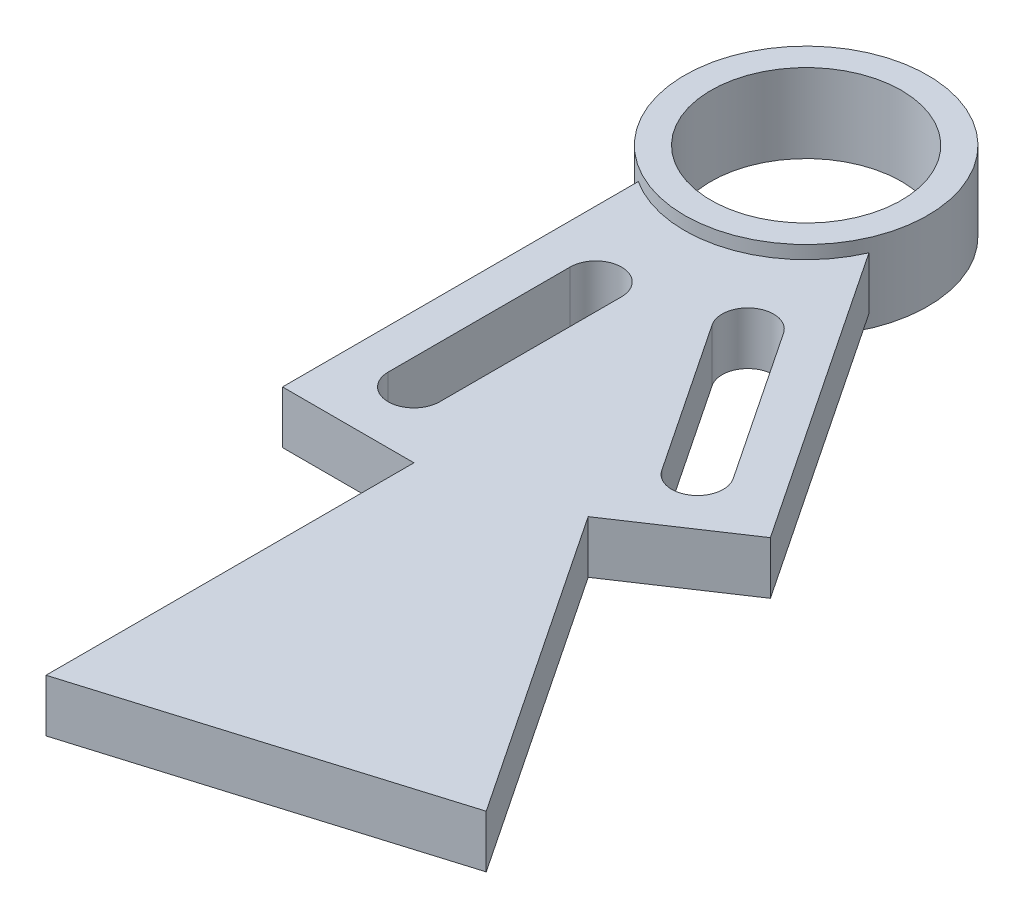
ISO-10303-21;
HEADER;
FILE_DESCRIPTION(('STEP AP214'),'2;1');
FILE_NAME('part.step','',(''),(''),'','','');
FILE_SCHEMA(('AUTOMOTIVE_DESIGN { 1 0 10303 214 1 1 1 1 }'));
ENDSEC;
DATA;
#1=APPLICATION_CONTEXT('core data for automotive mechanical design processes');
#2=APPLICATION_PROTOCOL_DEFINITION('international standard','automotive_design',2000,#1);
#3=PRODUCT_CONTEXT('',#1,'mechanical');
#4=PRODUCT('Part','Part','',(#3));
#5=PRODUCT_RELATED_PRODUCT_CATEGORY('part','',(#4));
#6=PRODUCT_DEFINITION_FORMATION('','',#4);
#7=PRODUCT_DEFINITION_CONTEXT('part definition',#1,'design');
#8=PRODUCT_DEFINITION('design','',#6,#7);
#9=PRODUCT_DEFINITION_SHAPE('','',#8);
#10=(LENGTH_UNIT() NAMED_UNIT(*) SI_UNIT(.MILLI.,.METRE.));
#11=(NAMED_UNIT(*) PLANE_ANGLE_UNIT() SI_UNIT($,.RADIAN.));
#12=(NAMED_UNIT(*) SI_UNIT($,.STERADIAN.) SOLID_ANGLE_UNIT());
#13=UNCERTAINTY_MEASURE_WITH_UNIT(LENGTH_MEASURE(1.E-05),#10,'distance_accuracy_value','');
#14=(GEOMETRIC_REPRESENTATION_CONTEXT(3) GLOBAL_UNCERTAINTY_ASSIGNED_CONTEXT((#13)) GLOBAL_UNIT_ASSIGNED_CONTEXT((#10,
#11,#12)) REPRESENTATION_CONTEXT('',''));
#15=CARTESIAN_POINT('',(0.,0.,0.));
#16=DIRECTION('',(0.,0.,1.));
#17=DIRECTION('',(1.,0.,0.));
#18=AXIS2_PLACEMENT_3D('',#15,#16,#17);
#19=CARTESIAN_POINT('',(0.,4.7625,0.));
#20=DIRECTION('',(0.,-1.,0.));
#21=DIRECTION('',(0.,0.,-1.));
#22=AXIS2_PLACEMENT_3D('',#19,#20,#21);
#23=CYLINDRICAL_SURFACE('',#22,11.5062);
#24=CARTESIAN_POINT('',(0.,4.7625,0.));
#25=DIRECTION('',(0.,1.,0.));
#26=DIRECTION('',(0.,0.,1.));
#27=AXIS2_PLACEMENT_3D('',#24,#25,#26);
#28=CIRCLE('',#27,11.5062);
#29=CARTESIAN_POINT('',(0.,4.7625,-11.5062));
#30=VERTEX_POINT('',#29);
#31=EDGE_CURVE('E53',#30,#30,#28,.T.);
#32=CARTESIAN_POINT('',(0.,-4.7625,0.));
#33=DIRECTION('',(0.,1.,0.));
#34=DIRECTION('',(0.,0.,1.));
#35=AXIS2_PLACEMENT_3D('',#32,#33,#34);
#36=CIRCLE('',#35,11.5062);
#37=CARTESIAN_POINT('',(0.,-4.7625,-11.5062));
#38=VERTEX_POINT('',#37);
#39=EDGE_CURVE('E273',#38,#38,#36,.T.);
#40=CARTESIAN_POINT('',(0.,4.7625,-11.5062));
#41=CARTESIAN_POINT('',(0.,4.66328125,-11.5062));
#42=CARTESIAN_POINT('',(0.,4.5640625,-11.5062));
#43=CARTESIAN_POINT('',(0.,4.365625,-11.5062));
#44=CARTESIAN_POINT('',(0.,4.26640625,-11.5062));
#45=CARTESIAN_POINT('',(0.,4.06796875,-11.5062));
#46=CARTESIAN_POINT('',(0.,3.96875,-11.5062));
#47=CARTESIAN_POINT('',(0.,3.7703125,-11.5062));
#48=CARTESIAN_POINT('',(0.,3.67109375,-11.5062));
#49=CARTESIAN_POINT('',(0.,3.47265625,-11.5062));
#50=CARTESIAN_POINT('',(0.,3.3734375,-11.5062));
#51=CARTESIAN_POINT('',(0.,3.175,-11.5062));
#52=CARTESIAN_POINT('',(0.,3.07578125,-11.5062));
#53=CARTESIAN_POINT('',(0.,2.87734375,-11.5062));
#54=CARTESIAN_POINT('',(0.,2.778125,-11.5062));
#55=CARTESIAN_POINT('',(0.,2.5796875,-11.5062));
#56=CARTESIAN_POINT('',(0.,2.48046875,-11.5062));
#57=CARTESIAN_POINT('',(0.,2.28203125,-11.5062));
#58=CARTESIAN_POINT('',(0.,2.1828125,-11.5062));
#59=CARTESIAN_POINT('',(0.,1.984375,-11.5062));
#60=CARTESIAN_POINT('',(0.,1.88515625,-11.5062));
#61=CARTESIAN_POINT('',(0.,1.68671875,-11.5062));
#62=CARTESIAN_POINT('',(0.,1.5875,-11.5062));
#63=CARTESIAN_POINT('',(0.,1.3890625,-11.5062));
#64=CARTESIAN_POINT('',(0.,1.28984375,-11.5062));
#65=CARTESIAN_POINT('',(0.,1.09140625,-11.5062));
#66=CARTESIAN_POINT('',(0.,0.992187499999999,-11.5062));
#67=CARTESIAN_POINT('',(0.,0.79375,-11.5062));
#68=CARTESIAN_POINT('',(0.,0.69453125,-11.5062));
#69=CARTESIAN_POINT('',(0.,0.49609375,-11.5062));
#70=CARTESIAN_POINT('',(0.,0.396875,-11.5062));
#71=CARTESIAN_POINT('',(0.,0.1984375,-11.5062));
#72=CARTESIAN_POINT('',(0.,0.0992187500000001,-11.5062));
#73=CARTESIAN_POINT('',(0.,-0.0992187500000001,-11.5062));
#74=CARTESIAN_POINT('',(0.,-0.1984375,-11.5062));
#75=CARTESIAN_POINT('',(0.,-0.396875,-11.5062));
#76=CARTESIAN_POINT('',(0.,-0.49609375,-11.5062));
#77=CARTESIAN_POINT('',(0.,-0.69453125,-11.5062));
#78=CARTESIAN_POINT('',(0.,-0.793750000000001,-11.5062));
#79=CARTESIAN_POINT('',(0.,-0.992187500000001,-11.5062));
#80=CARTESIAN_POINT('',(0.,-1.09140625,-11.5062));
#81=CARTESIAN_POINT('',(0.,-1.28984375,-11.5062));
#82=CARTESIAN_POINT('',(0.,-1.3890625,-11.5062));
#83=CARTESIAN_POINT('',(0.,-1.5875,-11.5062));
#84=CARTESIAN_POINT('',(0.,-1.68671875,-11.5062));
#85=CARTESIAN_POINT('',(0.,-1.88515625,-11.5062));
#86=CARTESIAN_POINT('',(0.,-1.984375,-11.5062));
#87=CARTESIAN_POINT('',(0.,-2.1828125,-11.5062));
#88=CARTESIAN_POINT('',(0.,-2.28203125,-11.5062));
#89=CARTESIAN_POINT('',(0.,-2.48046875,-11.5062));
#90=CARTESIAN_POINT('',(0.,-2.5796875,-11.5062));
#91=CARTESIAN_POINT('',(0.,-2.778125,-11.5062));
#92=CARTESIAN_POINT('',(0.,-2.87734375,-11.5062));
#93=CARTESIAN_POINT('',(0.,-3.07578125,-11.5062));
#94=CARTESIAN_POINT('',(0.,-3.175,-11.5062));
#95=CARTESIAN_POINT('',(0.,-3.3734375,-11.5062));
#96=CARTESIAN_POINT('',(0.,-3.47265625,-11.5062));
#97=CARTESIAN_POINT('',(0.,-3.67109375,-11.5062));
#98=CARTESIAN_POINT('',(0.,-3.7703125,-11.5062));
#99=CARTESIAN_POINT('',(0.,-3.96875,-11.5062));
#100=CARTESIAN_POINT('',(0.,-4.06796875,-11.5062));
#101=CARTESIAN_POINT('',(0.,-4.26640625,-11.5062));
#102=CARTESIAN_POINT('',(0.,-4.365625,-11.5062));
#103=CARTESIAN_POINT('',(0.,-4.5640625,-11.5062));
#104=CARTESIAN_POINT('',(0.,-4.66328125,-11.5062));
#105=CARTESIAN_POINT('',(0.,-4.7625,-11.5062));
#106=B_SPLINE_CURVE_WITH_KNOTS('',3,(#40,#41,#42,#43,#44,#45,#46,#47,#48,#49,#50,#51,#52,#53,
#54,#55,#56,#57,#58,#59,#60,#61,#62,#63,#64,#65,#66,#67,#68,#69,#70,#71,#72,#73,#74,#75,#76,#77,
#78,#79,#80,#81,#82,#83,#84,#85,#86,#87,#88,#89,#90,#91,#92,#93,#94,#95,#96,#97,#98,#99,#100,
#101,#102,#103,#104,#105),.UNSPECIFIED.,.F.,.F.,(4,2,2,2,2,2,2,2,2,2,2,2,2,2,2,2,2,2,2,2,2,2,2,
2,2,2,2,2,2,2,2,2,4),(0.,0.29765625,0.5953125,0.892968750000001,1.190625,1.48828125,1.7859375,
2.08359375,2.38125,2.67890625,2.9765625,3.27421875,3.571875,3.86953125,4.1671875,4.46484375,
4.7625,5.06015625,5.3578125,5.65546875,5.953125,6.25078125,6.5484375,6.84609375,7.14375,
7.44140625,7.7390625,8.03671875,8.334375,8.63203125,8.9296875,9.22734375,9.525),.UNSPECIFIED.);
#107=EDGE_CURVE('BSEAM45',#30,#38,#106,.T.);
#108=ORIENTED_EDGE('',*,*,#31,.T.);
#109=ORIENTED_EDGE('',*,*,#39,.F.);
#110=ORIENTED_EDGE('',*,*,#107,.T.);
#111=ORIENTED_EDGE('',*,*,#107,.F.);
#112=EDGE_LOOP('',(#108,#110,#109,#111));
#113=FACE_BOUND('',#112,.T.);
#114=ADVANCED_FACE('F45',(#113),#23,.F.);
#115=CARTESIAN_POINT('',(0.,4.7625,0.));
#116=DIRECTION('',(0.,-1.,0.));
#117=DIRECTION('',(0.,0.,-1.));
#118=AXIS2_PLACEMENT_3D('',#115,#116,#117);
#119=CYLINDRICAL_SURFACE('',#118,14.6812);
#120=DIRECTION('',(0.,-1.,0.));
#121=VECTOR('',#120,1.);
#122=CARTESIAN_POINT('',(-7.93749999999998,3.175,12.3504545337409));
#123=LINE('',#122,#121);
#124=CARTESIAN_POINT('',(-7.93749999999998,3.175,12.3504545337409));
#125=VERTEX_POINT('',#124);
#126=CARTESIAN_POINT('',(-7.93749999999998,-3.175,12.3504545337409));
#127=VERTEX_POINT('',#126);
#128=EDGE_CURVE('E66',#125,#127,#123,.T.);
#129=ORIENTED_EDGE('',*,*,#128,.F.);
#130=CARTESIAN_POINT('',(0.,3.175,0.));
#131=DIRECTION('',(0.,1.,0.));
#132=DIRECTION('',(0.,0.,1.));
#133=AXIS2_PLACEMENT_3D('',#130,#131,#132);
#134=CIRCLE('',#133,14.6812);
#135=CARTESIAN_POINT('',(13.4564435052088,3.175,5.87041409366696));
#136=VERTEX_POINT('',#135);
#137=EDGE_CURVE('E61',#125,#136,#134,.T.);
#138=ORIENTED_EDGE('',*,*,#137,.T.);
#139=DIRECTION('',(0.,-1.,0.));
#140=VECTOR('',#139,1.);
#141=CARTESIAN_POINT('',(13.4564435052088,3.175,5.87041409366696));
#142=LINE('',#141,#140);
#143=CARTESIAN_POINT('',(13.4564435052088,-3.175,5.87041409366696));
#144=VERTEX_POINT('',#143);
#145=EDGE_CURVE('E284',#136,#144,#142,.T.);
#146=ORIENTED_EDGE('',*,*,#145,.T.);
#147=CARTESIAN_POINT('',(0.,-3.175,0.));
#148=DIRECTION('',(0.,1.,0.));
#149=DIRECTION('',(0.,0.,1.));
#150=AXIS2_PLACEMENT_3D('',#147,#148,#149);
#151=CIRCLE('',#150,14.6812);
#152=EDGE_CURVE('E238',#127,#144,#151,.T.);
#153=ORIENTED_EDGE('',*,*,#152,.F.);
#154=EDGE_LOOP('',(#129,#138,#146,#153));
#155=FACE_BOUND('',#154,.T.);
#156=CARTESIAN_POINT('',(0.,4.7625,0.));
#157=DIRECTION('',(0.,1.,0.));
#158=DIRECTION('',(0.,0.,1.));
#159=AXIS2_PLACEMENT_3D('',#156,#157,#158);
#160=CIRCLE('',#159,14.6812);
#161=CARTESIAN_POINT('',(0.,4.7625,14.6812));
#162=VERTEX_POINT('',#161);
#163=EDGE_CURVE('E11',#162,#162,#160,.T.);
#164=ORIENTED_EDGE('',*,*,#163,.F.);
#165=EDGE_LOOP('',(#164));
#166=FACE_BOUND('',#165,.T.);
#167=CARTESIAN_POINT('',(0.,-4.7625,0.));
#168=DIRECTION('',(0.,1.,0.));
#169=DIRECTION('',(0.,0.,1.));
#170=AXIS2_PLACEMENT_3D('',#167,#168,#169);
#171=CIRCLE('',#170,14.6812);
#172=CARTESIAN_POINT('',(0.,-4.7625,14.6812));
#173=VERTEX_POINT('',#172);
#174=EDGE_CURVE('E48',#173,#173,#171,.T.);
#175=ORIENTED_EDGE('',*,*,#174,.T.);
#176=EDGE_LOOP('',(#175));
#177=FACE_BOUND('',#176,.T.);
#178=ADVANCED_FACE('F301',(#155,#166,#177),#119,.T.);
#179=CARTESIAN_POINT('',(0.,4.7625,0.));
#180=DIRECTION('',(0.,1.,0.));
#181=DIRECTION('',(0.,0.,1.));
#182=AXIS2_PLACEMENT_3D('',#179,#180,#181);
#183=PLANE('',#182);
#184=ORIENTED_EDGE('',*,*,#31,.F.);
#185=EDGE_LOOP('',(#184));
#186=FACE_BOUND('',#185,.T.);
#187=ORIENTED_EDGE('',*,*,#163,.T.);
#188=EDGE_LOOP('',(#187));
#189=FACE_BOUND('',#188,.T.);
#190=ADVANCED_FACE('F306',(#186,#189),#183,.T.);
#191=CARTESIAN_POINT('',(0.,-4.7625,0.));
#192=DIRECTION('',(0.,1.,0.));
#193=DIRECTION('',(0.,0.,1.));
#194=AXIS2_PLACEMENT_3D('',#191,#192,#193);
#195=PLANE('',#194);
#196=ORIENTED_EDGE('',*,*,#39,.T.);
#197=EDGE_LOOP('',(#196));
#198=FACE_BOUND('',#197,.T.);
#199=ORIENTED_EDGE('',*,*,#174,.F.);
#200=EDGE_LOOP('',(#199));
#201=FACE_BOUND('',#200,.T.);
#202=ADVANCED_FACE('F303',(#198,#201),#195,.F.);
#203=CARTESIAN_POINT('',(0.,3.175,25.4127));
#204=DIRECTION('',(0.,-1.,0.));
#205=DIRECTION('',(0.,0.,-1.));
#206=AXIS2_PLACEMENT_3D('',#203,#204,#205);
#207=CYLINDRICAL_SURFACE('',#206,3.1115);
#208=CARTESIAN_POINT('',(0.,-3.175,25.4127));
#209=DIRECTION('',(0.,1.,0.));
#210=DIRECTION('',(0.,0.,1.));
#211=AXIS2_PLACEMENT_3D('',#208,#209,#210);
#212=CIRCLE('',#211,3.1115);
#213=CARTESIAN_POINT('',(3.1115,-3.175,25.4127));
#214=VERTEX_POINT('',#213);
#215=CARTESIAN_POINT('',(-3.11150000000001,-3.175,25.4127));
#216=VERTEX_POINT('',#215);
#217=EDGE_CURVE('E253',#214,#216,#212,.T.);
#218=ORIENTED_EDGE('',*,*,#217,.F.);
#219=DIRECTION('',(0.,-1.,0.));
#220=VECTOR('',#219,1.);
#221=CARTESIAN_POINT('',(3.1115,3.175,25.4127));
#222=LINE('',#221,#220);
#223=CARTESIAN_POINT('',(3.1115,3.175,25.4127));
#224=VERTEX_POINT('',#223);
#225=EDGE_CURVE('E271',#224,#214,#222,.T.);
#226=ORIENTED_EDGE('',*,*,#225,.F.);
#227=CARTESIAN_POINT('',(0.,3.175,25.4127));
#228=DIRECTION('',(0.,1.,0.));
#229=DIRECTION('',(0.,0.,1.));
#230=AXIS2_PLACEMENT_3D('',#227,#228,#229);
#231=CIRCLE('',#230,3.1115);
#232=CARTESIAN_POINT('',(-3.11150000000001,3.175,25.4127));
#233=VERTEX_POINT('',#232);
#234=EDGE_CURVE('E208',#224,#233,#231,.T.);
#235=ORIENTED_EDGE('',*,*,#234,.T.);
#236=DIRECTION('',(0.,-1.,0.));
#237=VECTOR('',#236,1.);
#238=CARTESIAN_POINT('',(-3.11150000000001,3.175,25.4127));
#239=LINE('',#238,#237);
#240=EDGE_CURVE('E264',#233,#216,#239,.T.);
#241=ORIENTED_EDGE('',*,*,#240,.T.);
#242=EDGE_LOOP('',(#218,#226,#235,#241));
#243=FACE_BOUND('',#242,.T.);
#244=ADVANCED_FACE('F305',(#243),#207,.F.);
#245=CARTESIAN_POINT('',(3.11149999999999,3.175,0.));
#246=DIRECTION('',(-1.,0.,0.));
#247=DIRECTION('',(0.,0.,1.));
#248=AXIS2_PLACEMENT_3D('',#245,#246,#247);
#249=PLANE('',#248);
#250=DIRECTION('',(0.,0.,-1.));
#251=VECTOR('',#250,1.);
#252=CARTESIAN_POINT('',(3.11149999999999,-3.175,0.));
#253=LINE('',#252,#251);
#254=CARTESIAN_POINT('',(3.1115,-3.175,47.3837));
#255=VERTEX_POINT('',#254);
#256=EDGE_CURVE('E256',#255,#214,#253,.T.);
#257=ORIENTED_EDGE('',*,*,#256,.F.);
#258=DIRECTION('',(0.,-1.,0.));
#259=VECTOR('',#258,1.);
#260=CARTESIAN_POINT('',(3.1115,3.175,47.3837));
#261=LINE('',#260,#259);
#262=CARTESIAN_POINT('',(3.1115,3.175,47.3837));
#263=VERTEX_POINT('',#262);
#264=EDGE_CURVE('E269',#263,#255,#261,.T.);
#265=ORIENTED_EDGE('',*,*,#264,.F.);
#266=DIRECTION('',(0.,0.,-1.));
#267=VECTOR('',#266,1.);
#268=CARTESIAN_POINT('',(3.11149999999999,3.175,0.));
#269=LINE('',#268,#267);
#270=EDGE_CURVE('E211',#263,#224,#269,.T.);
#271=ORIENTED_EDGE('',*,*,#270,.T.);
#272=ORIENTED_EDGE('',*,*,#225,.T.);
#273=EDGE_LOOP('',(#257,#265,#271,#272));
#274=FACE_BOUND('',#273,.T.);
#275=ADVANCED_FACE('F313',(#274),#249,.T.);
#276=CARTESIAN_POINT('',(0.,3.175,47.3837));
#277=DIRECTION('',(0.,-1.,0.));
#278=DIRECTION('',(0.,0.,-1.));
#279=AXIS2_PLACEMENT_3D('',#276,#277,#278);
#280=CYLINDRICAL_SURFACE('',#279,3.1115);
#281=CARTESIAN_POINT('',(0.,-3.175,47.3837));
#282=DIRECTION('',(0.,1.,0.));
#283=DIRECTION('',(0.,0.,1.));
#284=AXIS2_PLACEMENT_3D('',#281,#282,#283);
#285=CIRCLE('',#284,3.1115);
#286=CARTESIAN_POINT('',(-3.1115,-3.175,47.3837));
#287=VERTEX_POINT('',#286);
#288=EDGE_CURVE('E259',#287,#255,#285,.T.);
#289=ORIENTED_EDGE('',*,*,#288,.F.);
#290=DIRECTION('',(0.,-1.,0.));
#291=VECTOR('',#290,1.);
#292=CARTESIAN_POINT('',(-3.1115,3.175,47.3837));
#293=LINE('',#292,#291);
#294=CARTESIAN_POINT('',(-3.1115,3.175,47.3837));
#295=VERTEX_POINT('',#294);
#296=EDGE_CURVE('E266',#295,#287,#293,.T.);
#297=ORIENTED_EDGE('',*,*,#296,.F.);
#298=CARTESIAN_POINT('',(0.,3.175,47.3837));
#299=DIRECTION('',(0.,1.,0.));
#300=DIRECTION('',(0.,0.,1.));
#301=AXIS2_PLACEMENT_3D('',#298,#299,#300);
#302=CIRCLE('',#301,3.1115);
#303=EDGE_CURVE('E214',#295,#263,#302,.T.);
#304=ORIENTED_EDGE('',*,*,#303,.T.);
#305=ORIENTED_EDGE('',*,*,#264,.T.);
#306=EDGE_LOOP('',(#289,#297,#304,#305));
#307=FACE_BOUND('',#306,.T.);
#308=ADVANCED_FACE('F342',(#307),#280,.F.);
#309=CARTESIAN_POINT('',(-6.60346570833968,3.175,4.40433274047045));
#310=DIRECTION('',(0.831932687664855,0.,-0.554876565728569));
#311=DIRECTION('',(-0.554876565728569,0.,-0.831932687664855));
#312=AXIS2_PLACEMENT_3D('',#309,#310,#311);
#313=PLANE('',#312);
#314=DIRECTION('',(0.554876565728569,0.,0.831932687664855));
#315=VECTOR('',#314,1.);
#316=CARTESIAN_POINT('',(-6.60346570833968,-3.175,4.40433274047045));
#317=LINE('',#316,#315);
#318=CARTESIAN_POINT('',(24.0929717596436,-3.175,50.4278473413153));
#319=VERTEX_POINT('',#318);
#320=CARTESIAN_POINT('',(48.7572351062785,-3.175,87.4072553080181));
#321=VERTEX_POINT('',#320);
#322=EDGE_CURVE('E229',#319,#321,#317,.T.);
#323=ORIENTED_EDGE('',*,*,#322,.F.);
#324=DIRECTION('',(0.,-1.,0.));
#325=VECTOR('',#324,1.);
#326=CARTESIAN_POINT('',(24.0929717596436,3.175,50.4278473413153));
#327=LINE('',#326,#325);
#328=CARTESIAN_POINT('',(24.0929717596436,3.175,50.4278473413153));
#329=VERTEX_POINT('',#328);
#330=EDGE_CURVE('E267',#329,#319,#327,.T.);
#331=ORIENTED_EDGE('',*,*,#330,.F.);
#332=DIRECTION('',(0.554876565728569,0.,0.831932687664855));
#333=VECTOR('',#332,1.);
#334=CARTESIAN_POINT('',(-6.60346570833968,3.175,4.40433274047045));
#335=LINE('',#334,#333);
#336=CARTESIAN_POINT('',(48.7572351062785,3.175,87.4072553080181));
#337=VERTEX_POINT('',#336);
#338=EDGE_CURVE('E188',#329,#337,#335,.T.);
#339=ORIENTED_EDGE('',*,*,#338,.T.);
#340=DIRECTION('',(0.,-1.,0.));
#341=VECTOR('',#340,1.);
#342=CARTESIAN_POINT('',(48.7572351062785,3.175,87.4072553080181));
#343=LINE('',#342,#341);
#344=EDGE_CURVE('E167',#337,#321,#343,.T.);
#345=ORIENTED_EDGE('',*,*,#344,.T.);
#346=EDGE_LOOP('',(#323,#331,#339,#345));
#347=FACE_BOUND('',#346,.T.);
#348=ADVANCED_FACE('F351',(#347),#313,.T.);
#349=CARTESIAN_POINT('',(30.6964374679833,3.175,46.0235146008449));
#350=DIRECTION('',(-0.554876565728569,0.,-0.831932687664855));
#351=DIRECTION('',(-0.831932687664855,0.,0.554876565728569));
#352=AXIS2_PLACEMENT_3D('',#349,#350,#351);
#353=PLANE('',#352);
#354=DIRECTION('',(0.831932687664855,0.,-0.554876565728569));
#355=VECTOR('',#354,1.);
#356=CARTESIAN_POINT('',(30.6964374679833,-3.175,46.0235146008449));
#357=LINE('',#356,#355);
#358=CARTESIAN_POINT('',(37.2999031763232,-3.175,41.6191818603743));
#359=VERTEX_POINT('',#358);
#360=EDGE_CURVE('E232',#319,#359,#357,.T.);
#361=ORIENTED_EDGE('',*,*,#360,.T.);
#362=DIRECTION('',(0.,-1.,0.));
#363=VECTOR('',#362,1.);
#364=CARTESIAN_POINT('',(37.2999031763232,3.175,41.6191818603743));
#365=LINE('',#364,#363);
#366=CARTESIAN_POINT('',(37.2999031763232,3.175,41.6191818603743));
#367=VERTEX_POINT('',#366);
#368=EDGE_CURVE('E286',#367,#359,#365,.T.);
#369=ORIENTED_EDGE('',*,*,#368,.F.);
#370=DIRECTION('',(0.831932687664855,0.,-0.554876565728569));
#371=VECTOR('',#370,1.);
#372=CARTESIAN_POINT('',(30.6964374679833,3.175,46.0235146008449));
#373=LINE('',#372,#371);
#374=EDGE_CURVE('E191',#329,#367,#373,.T.);
#375=ORIENTED_EDGE('',*,*,#374,.F.);
#376=ORIENTED_EDGE('',*,*,#330,.T.);
#377=EDGE_LOOP('',(#361,#369,#375,#376));
#378=FACE_BOUND('',#377,.T.);
#379=ADVANCED_FACE('F360',(#378),#353,.F.);
#380=CARTESIAN_POINT('',(6.60346570833989,3.175,-4.40433274047059));
#381=DIRECTION('',(-0.831932687664855,0.,0.554876565728569));
#382=DIRECTION('',(0.554876565728569,0.,0.831932687664855));
#383=AXIS2_PLACEMENT_3D('',#380,#381,#382);
#384=PLANE('',#383);
#385=DIRECTION('',(-0.554876565728569,0.,-0.831932687664855));
#386=VECTOR('',#385,1.);
#387=CARTESIAN_POINT('',(6.60346570833989,-3.175,-4.40433274047059));
#388=LINE('',#387,#386);
#389=EDGE_CURVE('E235',#359,#144,#388,.T.);
#390=ORIENTED_EDGE('',*,*,#389,.T.);
#391=ORIENTED_EDGE('',*,*,#145,.F.);
#392=DIRECTION('',(-0.554876565728569,0.,-0.831932687664855));
#393=VECTOR('',#392,1.);
#394=CARTESIAN_POINT('',(6.60346570833989,3.175,-4.40433274047059));
#395=LINE('',#394,#393);
#396=EDGE_CURVE('E194',#367,#136,#395,.T.);
#397=ORIENTED_EDGE('',*,*,#396,.F.);
#398=ORIENTED_EDGE('',*,*,#368,.T.);
#399=EDGE_LOOP('',(#390,#391,#397,#398));
#400=FACE_BOUND('',#399,.T.);
#401=ADVANCED_FACE('F369',(#400),#384,.F.);
#402=CARTESIAN_POINT('',(-7.93749999999998,3.175,0.));
#403=DIRECTION('',(-1.,0.,0.));
#404=DIRECTION('',(0.,0.,1.));
#405=AXIS2_PLACEMENT_3D('',#402,#403,#404);
#406=PLANE('',#405);
#407=DIRECTION('',(0.,0.,-1.));
#408=VECTOR('',#407,1.);
#409=CARTESIAN_POINT('',(-7.93749999999998,-3.175,0.));
#410=LINE('',#409,#408);
#411=CARTESIAN_POINT('',(-7.93749999999998,-3.175,55.3212));
#412=VERTEX_POINT('',#411);
#413=EDGE_CURVE('E241',#412,#127,#410,.T.);
#414=ORIENTED_EDGE('',*,*,#413,.F.);
#415=DIRECTION('',(0.,-1.,0.));
#416=VECTOR('',#415,1.);
#417=CARTESIAN_POINT('',(-7.93749999999998,3.175,55.3212));
#418=LINE('',#417,#416);
#419=CARTESIAN_POINT('',(-7.93749999999998,3.175,55.3212));
#420=VERTEX_POINT('',#419);
#421=EDGE_CURVE('E281',#420,#412,#418,.T.);
#422=ORIENTED_EDGE('',*,*,#421,.F.);
#423=DIRECTION('',(0.,0.,-1.));
#424=VECTOR('',#423,1.);
#425=CARTESIAN_POINT('',(-7.93749999999998,3.175,0.));
#426=LINE('',#425,#424);
#427=EDGE_CURVE('E197',#420,#125,#426,.T.);
#428=ORIENTED_EDGE('',*,*,#427,.T.);
#429=ORIENTED_EDGE('',*,*,#128,.T.);
#430=EDGE_LOOP('',(#414,#422,#428,#429));
#431=FACE_BOUND('',#430,.T.);
#432=ADVANCED_FACE('F378',(#431),#406,.T.);
#433=CARTESIAN_POINT('',(0.,3.175,55.3212));
#434=DIRECTION('',(0.,0.,-1.));
#435=DIRECTION('',(-1.,0.,0.));
#436=AXIS2_PLACEMENT_3D('',#433,#434,#435);
#437=PLANE('',#436);
#438=DIRECTION('',(1.,0.,0.));
#439=VECTOR('',#438,1.);
#440=CARTESIAN_POINT('',(0.,-3.175,55.3212));
#441=LINE('',#440,#439);
#442=CARTESIAN_POINT('',(7.93750000000002,-3.175,55.3212));
#443=VERTEX_POINT('',#442);
#444=EDGE_CURVE('E244',#412,#443,#441,.T.);
#445=ORIENTED_EDGE('',*,*,#444,.T.);
#446=DIRECTION('',(0.,-1.,0.));
#447=VECTOR('',#446,1.);
#448=CARTESIAN_POINT('',(7.93750000000002,3.175,55.3212));
#449=LINE('',#448,#447);
#450=CARTESIAN_POINT('',(7.93750000000002,3.175,55.3212));
#451=VERTEX_POINT('',#450);
#452=EDGE_CURVE('E278',#451,#443,#449,.T.);
#453=ORIENTED_EDGE('',*,*,#452,.F.);
#454=DIRECTION('',(1.,0.,0.));
#455=VECTOR('',#454,1.);
#456=CARTESIAN_POINT('',(0.,3.175,55.3212));
#457=LINE('',#456,#455);
#458=EDGE_CURVE('E200',#420,#451,#457,.T.);
#459=ORIENTED_EDGE('',*,*,#458,.F.);
#460=ORIENTED_EDGE('',*,*,#421,.T.);
#461=EDGE_LOOP('',(#445,#453,#459,#460));
#462=FACE_BOUND('',#461,.T.);
#463=ADVANCED_FACE('F387',(#462),#437,.F.);
#464=CARTESIAN_POINT('',(7.93750000000005,3.175,0.));
#465=DIRECTION('',(1.,0.,0.));
#466=DIRECTION('',(0.,0.,-1.));
#467=AXIS2_PLACEMENT_3D('',#464,#465,#466);
#468=PLANE('',#467);
#469=DIRECTION('',(0.,0.,1.));
#470=VECTOR('',#469,1.);
#471=CARTESIAN_POINT('',(7.93750000000005,-3.175,0.));
#472=LINE('',#471,#470);
#473=CARTESIAN_POINT('',(7.9375,-3.175,99.7712));
#474=VERTEX_POINT('',#473);
#475=EDGE_CURVE('E247',#443,#474,#472,.T.);
#476=ORIENTED_EDGE('',*,*,#475,.T.);
#477=DIRECTION('',(0.,-1.,0.));
#478=VECTOR('',#477,1.);
#479=CARTESIAN_POINT('',(7.9375,3.175,99.7712));
#480=LINE('',#479,#478);
#481=CARTESIAN_POINT('',(7.9375,3.175,99.7712));
#482=VERTEX_POINT('',#481);
#483=EDGE_CURVE('E275',#482,#474,#480,.T.);
#484=ORIENTED_EDGE('',*,*,#483,.F.);
#485=DIRECTION('',(0.,0.,1.));
#486=VECTOR('',#485,1.);
#487=CARTESIAN_POINT('',(7.93750000000005,3.175,0.));
#488=LINE('',#487,#486);
#489=EDGE_CURVE('E203',#451,#482,#488,.T.);
#490=ORIENTED_EDGE('',*,*,#489,.F.);
#491=ORIENTED_EDGE('',*,*,#452,.T.);
#492=EDGE_LOOP('',(#476,#484,#490,#491));
#493=FACE_BOUND('',#492,.T.);
#494=ADVANCED_FACE('F396',(#493),#468,.F.);
#495=CARTESIAN_POINT('',(26.2921047275129,3.175,39.420048892505));
#496=DIRECTION('',(0.,-1.,0.));
#497=DIRECTION('',(0.,0.,-1.));
#498=AXIS2_PLACEMENT_3D('',#495,#496,#497);
#499=CYLINDRICAL_SURFACE('',#498,3.1115);
#500=CARTESIAN_POINT('',(26.2921047275129,-3.175,39.420048892505));
#501=DIRECTION('',(0.,1.,0.));
#502=DIRECTION('',(0.,0.,1.));
#503=AXIS2_PLACEMENT_3D('',#500,#501,#502);
#504=CIRCLE('',#503,3.1115);
#505=CARTESIAN_POINT('',(23.7035461698437,-3.175,41.1465473267695));
#506=VERTEX_POINT('',#505);
#507=CARTESIAN_POINT('',(28.880663285182,-3.175,37.6935504582406));
#508=VERTEX_POINT('',#507);
#509=EDGE_CURVE('E162',#506,#508,#504,.T.);
#510=ORIENTED_EDGE('',*,*,#509,.F.);
#511=DIRECTION('',(0.,-1.,0.));
#512=VECTOR('',#511,1.);
#513=CARTESIAN_POINT('',(23.7035461698437,3.175,41.1465473267695));
#514=LINE('',#513,#512);
#515=CARTESIAN_POINT('',(23.7035461698437,3.175,41.1465473267695));
#516=VERTEX_POINT('',#515);
#517=EDGE_CURVE('E157',#516,#506,#514,.T.);
#518=ORIENTED_EDGE('',*,*,#517,.F.);
#519=CARTESIAN_POINT('',(26.2921047275129,3.175,39.420048892505));
#520=DIRECTION('',(0.,1.,0.));
#521=DIRECTION('',(0.,0.,1.));
#522=AXIS2_PLACEMENT_3D('',#519,#520,#521);
#523=CIRCLE('',#522,3.1115);
#524=CARTESIAN_POINT('',(28.880663285182,3.175,37.6935504582406));
#525=VERTEX_POINT('',#524);
#526=EDGE_CURVE('E160',#516,#525,#523,.T.);
#527=ORIENTED_EDGE('',*,*,#526,.T.);
#528=DIRECTION('',(0.,-1.,0.));
#529=VECTOR('',#528,1.);
#530=CARTESIAN_POINT('',(28.880663285182,3.175,37.6935504582406));
#531=LINE('',#530,#529);
#532=EDGE_CURVE('E219',#525,#508,#531,.T.);
#533=ORIENTED_EDGE('',*,*,#532,.T.);
#534=EDGE_LOOP('',(#510,#518,#527,#533));
#535=FACE_BOUND('',#534,.T.);
#536=ADVANCED_FACE('F159',(#535),#499,.F.);
#537=CARTESIAN_POINT('',(-2.5885585576691,3.175,1.72649843426438));
#538=DIRECTION('',(0.831932687664855,0.,-0.554876565728569));
#539=DIRECTION('',(-0.554876565728569,0.,-0.831932687664855));
#540=AXIS2_PLACEMENT_3D('',#537,#538,#539);
#541=PLANE('',#540);
#542=DIRECTION('',(0.554876565728569,0.,0.831932687664855));
#543=VECTOR('',#542,1.);
#544=CARTESIAN_POINT('',(-2.5885585576691,-3.175,1.72649843426438));
#545=LINE('',#544,#543);
#546=CARTESIAN_POINT('',(11.5123531442213,-3.175,22.868154246085));
#547=VERTEX_POINT('',#546);
#548=EDGE_CURVE('E221',#547,#506,#545,.T.);
#549=ORIENTED_EDGE('',*,*,#548,.F.);
#550=DIRECTION('',(0.,-1.,0.));
#551=VECTOR('',#550,1.);
#552=CARTESIAN_POINT('',(11.5123531442213,3.175,22.868154246085));
#553=LINE('',#552,#551);
#554=CARTESIAN_POINT('',(11.5123531442213,3.175,22.868154246085));
#555=VERTEX_POINT('',#554);
#556=EDGE_CURVE('E168',#555,#547,#553,.T.);
#557=ORIENTED_EDGE('',*,*,#556,.F.);
#558=DIRECTION('',(0.554876565728569,0.,0.831932687664855));
#559=VECTOR('',#558,1.);
#560=CARTESIAN_POINT('',(-2.5885585576691,3.175,1.72649843426438));
#561=LINE('',#560,#559);
#562=EDGE_CURVE('E175',#555,#516,#561,.T.);
#563=ORIENTED_EDGE('',*,*,#562,.T.);
#564=ORIENTED_EDGE('',*,*,#517,.T.);
#565=EDGE_LOOP('',(#549,#557,#563,#564));
#566=FACE_BOUND('',#565,.T.);
#567=ADVANCED_FACE('F182',(#566),#541,.T.);
#568=CARTESIAN_POINT('',(14.1009117018905,3.175,21.1416558118205));
#569=DIRECTION('',(0.,-1.,0.));
#570=DIRECTION('',(0.,0.,-1.));
#571=AXIS2_PLACEMENT_3D('',#568,#569,#570);
#572=CYLINDRICAL_SURFACE('',#571,3.1115);
#573=CARTESIAN_POINT('',(14.1009117018905,-3.175,21.1416558118205));
#574=DIRECTION('',(0.,1.,0.));
#575=DIRECTION('',(0.,0.,1.));
#576=AXIS2_PLACEMENT_3D('',#573,#574,#575);
#577=CIRCLE('',#576,3.1115);
#578=CARTESIAN_POINT('',(16.6894702595597,-3.175,19.4151573775561));
#579=VERTEX_POINT('',#578);
#580=EDGE_CURVE('E223',#579,#547,#577,.T.);
#581=ORIENTED_EDGE('',*,*,#580,.F.);
#582=DIRECTION('',(0.,-1.,0.));
#583=VECTOR('',#582,1.);
#584=CARTESIAN_POINT('',(16.6894702595597,3.175,19.4151573775561));
#585=LINE('',#584,#583);
#586=CARTESIAN_POINT('',(16.6894702595597,3.175,19.4151573775561));
#587=VERTEX_POINT('',#586);
#588=EDGE_CURVE('E291',#587,#579,#585,.T.);
#589=ORIENTED_EDGE('',*,*,#588,.F.);
#590=CARTESIAN_POINT('',(14.1009117018905,3.175,21.1416558118205));
#591=DIRECTION('',(0.,1.,0.));
#592=DIRECTION('',(0.,0.,1.));
#593=AXIS2_PLACEMENT_3D('',#590,#591,#592);
#594=CIRCLE('',#593,3.1115);
#595=EDGE_CURVE('E183',#587,#555,#594,.T.);
#596=ORIENTED_EDGE('',*,*,#595,.T.);
#597=ORIENTED_EDGE('',*,*,#556,.T.);
#598=EDGE_LOOP('',(#581,#589,#596,#597));
#599=FACE_BOUND('',#598,.T.);
#600=ADVANCED_FACE('F420',(#599),#572,.F.);
#601=CARTESIAN_POINT('',(28.3473675531395,3.175,93.589227654009));
#602=DIRECTION('',(-0.289885591514263,0.,-0.957061306203749));
#603=DIRECTION('',(-0.957061306203749,0.,0.289885591514263));
#604=AXIS2_PLACEMENT_3D('',#601,#602,#603);
#605=PLANE('',#604);
#606=DIRECTION('',(0.957061306203749,0.,-0.289885591514263));
#607=VECTOR('',#606,1.);
#608=CARTESIAN_POINT('',(28.3473675531395,-3.175,93.589227654009));
#609=LINE('',#608,#607);
#610=EDGE_CURVE('E250',#474,#321,#609,.T.);
#611=ORIENTED_EDGE('',*,*,#610,.T.);
#612=ORIENTED_EDGE('',*,*,#344,.F.);
#613=DIRECTION('',(0.957061306203749,0.,-0.289885591514263));
#614=VECTOR('',#613,1.);
#615=CARTESIAN_POINT('',(28.3473675531395,3.175,93.589227654009));
#616=LINE('',#615,#614);
#617=EDGE_CURVE('E206',#482,#337,#616,.T.);
#618=ORIENTED_EDGE('',*,*,#617,.F.);
#619=ORIENTED_EDGE('',*,*,#483,.T.);
#620=EDGE_LOOP('',(#611,#612,#618,#619));
#621=FACE_BOUND('',#620,.T.);
#622=ADVANCED_FACE('F428',(#621),#605,.F.);
#623=CARTESIAN_POINT('',(2.58855855766928,3.175,-1.7264984342645));
#624=DIRECTION('',(0.831932687664854,0.,-0.554876565728569));
#625=DIRECTION('',(-0.55487656572857,0.,-0.831932687664855));
#626=AXIS2_PLACEMENT_3D('',#623,#624,#625);
#627=PLANE('',#626);
#628=DIRECTION('',(0.55487656572857,0.,0.831932687664855));
#629=VECTOR('',#628,1.);
#630=CARTESIAN_POINT('',(2.58855855766928,-3.175,-1.7264984342645));
#631=LINE('',#630,#629);
#632=EDGE_CURVE('E226',#579,#508,#631,.T.);
#633=ORIENTED_EDGE('',*,*,#632,.T.);
#634=ORIENTED_EDGE('',*,*,#532,.F.);
#635=DIRECTION('',(0.55487656572857,0.,0.831932687664855));
#636=VECTOR('',#635,1.);
#637=CARTESIAN_POINT('',(2.58855855766928,3.175,-1.7264984342645));
#638=LINE('',#637,#636);
#639=EDGE_CURVE('E178',#587,#525,#638,.T.);
#640=ORIENTED_EDGE('',*,*,#639,.F.);
#641=ORIENTED_EDGE('',*,*,#588,.T.);
#642=EDGE_LOOP('',(#633,#634,#640,#641));
#643=FACE_BOUND('',#642,.T.);
#644=ADVANCED_FACE('F437',(#643),#627,.F.);
#645=CARTESIAN_POINT('',(-3.11150000000001,3.175,0.));
#646=DIRECTION('',(-1.,0.,0.));
#647=DIRECTION('',(0.,0.,1.));
#648=AXIS2_PLACEMENT_3D('',#645,#646,#647);
#649=PLANE('',#648);
#650=DIRECTION('',(0.,0.,-1.));
#651=VECTOR('',#650,1.);
#652=CARTESIAN_POINT('',(-3.11150000000001,-3.175,0.));
#653=LINE('',#652,#651);
#654=EDGE_CURVE('E180',#287,#216,#653,.T.);
#655=ORIENTED_EDGE('',*,*,#654,.T.);
#656=ORIENTED_EDGE('',*,*,#240,.F.);
#657=DIRECTION('',(0.,0.,-1.));
#658=VECTOR('',#657,1.);
#659=CARTESIAN_POINT('',(-3.11150000000001,3.175,0.));
#660=LINE('',#659,#658);
#661=EDGE_CURVE('E217',#295,#233,#660,.T.);
#662=ORIENTED_EDGE('',*,*,#661,.F.);
#663=ORIENTED_EDGE('',*,*,#296,.T.);
#664=EDGE_LOOP('',(#655,#656,#662,#663));
#665=FACE_BOUND('',#664,.T.);
#666=ADVANCED_FACE('F446',(#665),#649,.F.);
#667=CARTESIAN_POINT('',(0.,3.175,0.));
#668=DIRECTION('',(0.,1.,0.));
#669=DIRECTION('',(0.,0.,1.));
#670=AXIS2_PLACEMENT_3D('',#667,#668,#669);
#671=PLANE('',#670);
#672=ORIENTED_EDGE('',*,*,#526,.F.);
#673=ORIENTED_EDGE('',*,*,#562,.F.);
#674=ORIENTED_EDGE('',*,*,#595,.F.);
#675=ORIENTED_EDGE('',*,*,#639,.T.);
#676=EDGE_LOOP('',(#672,#673,#674,#675));
#677=FACE_BOUND('',#676,.T.);
#678=ORIENTED_EDGE('',*,*,#338,.F.);
#679=ORIENTED_EDGE('',*,*,#374,.T.);
#680=ORIENTED_EDGE('',*,*,#396,.T.);
#681=ORIENTED_EDGE('',*,*,#137,.F.);
#682=ORIENTED_EDGE('',*,*,#427,.F.);
#683=ORIENTED_EDGE('',*,*,#458,.T.);
#684=ORIENTED_EDGE('',*,*,#489,.T.);
#685=ORIENTED_EDGE('',*,*,#617,.T.);
#686=EDGE_LOOP('',(#678,#679,#680,#681,#682,#683,#684,#685));
#687=FACE_BOUND('',#686,.T.);
#688=ORIENTED_EDGE('',*,*,#234,.F.);
#689=ORIENTED_EDGE('',*,*,#270,.F.);
#690=ORIENTED_EDGE('',*,*,#303,.F.);
#691=ORIENTED_EDGE('',*,*,#661,.T.);
#692=EDGE_LOOP('',(#688,#689,#690,#691));
#693=FACE_BOUND('',#692,.T.);
#694=ADVANCED_FACE('F172',(#677,#687,#693),#671,.T.);
#695=CARTESIAN_POINT('',(0.,-3.175,0.));
#696=DIRECTION('',(0.,1.,0.));
#697=DIRECTION('',(0.,0.,1.));
#698=AXIS2_PLACEMENT_3D('',#695,#696,#697);
#699=PLANE('',#698);
#700=ORIENTED_EDGE('',*,*,#509,.T.);
#701=ORIENTED_EDGE('',*,*,#632,.F.);
#702=ORIENTED_EDGE('',*,*,#580,.T.);
#703=ORIENTED_EDGE('',*,*,#548,.T.);
#704=EDGE_LOOP('',(#700,#701,#702,#703));
#705=FACE_BOUND('',#704,.T.);
#706=ORIENTED_EDGE('',*,*,#322,.T.);
#707=ORIENTED_EDGE('',*,*,#610,.F.);
#708=ORIENTED_EDGE('',*,*,#475,.F.);
#709=ORIENTED_EDGE('',*,*,#444,.F.);
#710=ORIENTED_EDGE('',*,*,#413,.T.);
#711=ORIENTED_EDGE('',*,*,#152,.T.);
#712=ORIENTED_EDGE('',*,*,#389,.F.);
#713=ORIENTED_EDGE('',*,*,#360,.F.);
#714=EDGE_LOOP('',(#706,#707,#708,#709,#710,#711,#712,#713));
#715=FACE_BOUND('',#714,.T.);
#716=ORIENTED_EDGE('',*,*,#217,.T.);
#717=ORIENTED_EDGE('',*,*,#654,.F.);
#718=ORIENTED_EDGE('',*,*,#288,.T.);
#719=ORIENTED_EDGE('',*,*,#256,.T.);
#720=EDGE_LOOP('',(#716,#717,#718,#719));
#721=FACE_BOUND('',#720,.T.);
#722=ADVANCED_FACE('F463',(#705,#715,#721),#699,.F.);
#723=CLOSED_SHELL('',(#114,#178,#190,#202,#244,#275,#308,#348,#379,#401,#432,#463,#494,#536,
#567,#600,#622,#644,#666,#694,#722));
#724=MANIFOLD_SOLID_BREP('B2',#723);
#725=ADVANCED_BREP_SHAPE_REPRESENTATION('',(#18,#724),#14);
#726=SHAPE_DEFINITION_REPRESENTATION(#9,#725);
ENDSEC;
END-ISO-10303-21;
